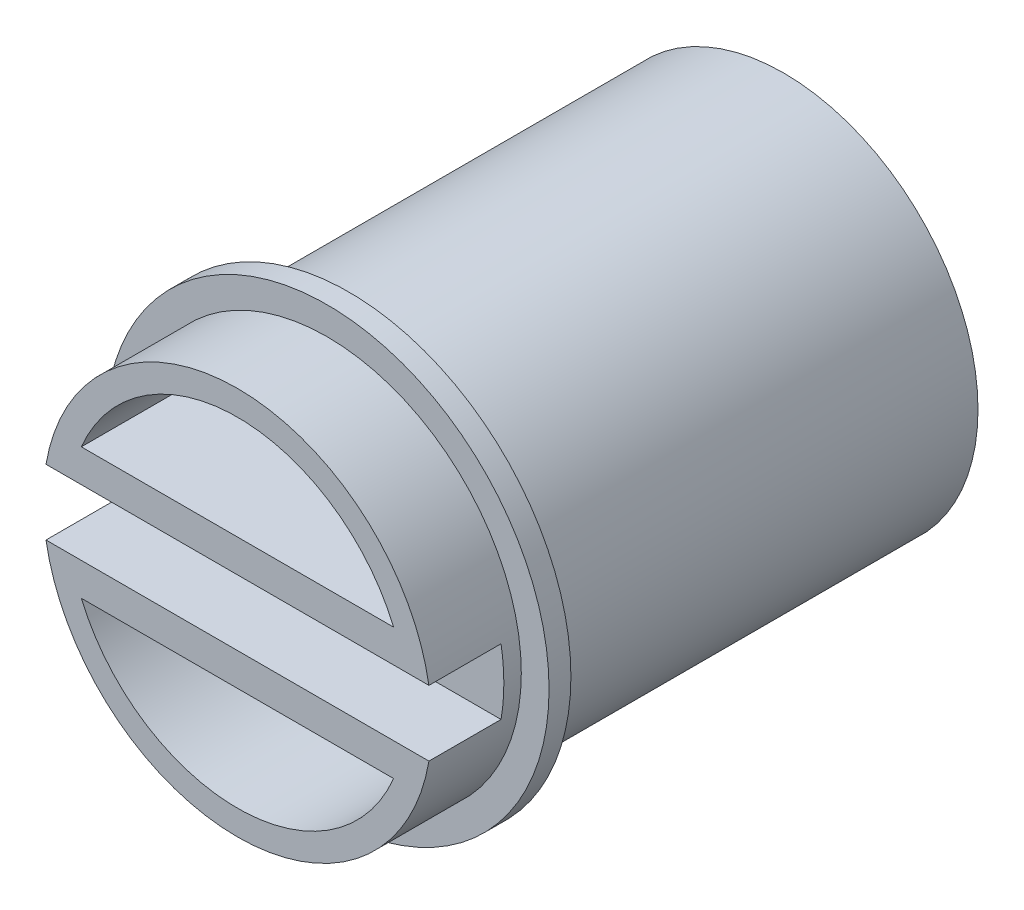
ISO-10303-21;
HEADER;
FILE_DESCRIPTION(('STEP AP214'),'2;1');
FILE_NAME('part.step','',(''),(''),'','','');
FILE_SCHEMA(('AUTOMOTIVE_DESIGN { 1 0 10303 214 1 1 1 1 }'));
ENDSEC;
DATA;
#1=APPLICATION_CONTEXT('core data for automotive mechanical design processes');
#2=APPLICATION_PROTOCOL_DEFINITION('international standard','automotive_design',2000,#1);
#3=PRODUCT_CONTEXT('',#1,'mechanical');
#4=PRODUCT('Part','Part','',(#3));
#5=PRODUCT_RELATED_PRODUCT_CATEGORY('part','',(#4));
#6=PRODUCT_DEFINITION_FORMATION('','',#4);
#7=PRODUCT_DEFINITION_CONTEXT('part definition',#1,'design');
#8=PRODUCT_DEFINITION('design','',#6,#7);
#9=PRODUCT_DEFINITION_SHAPE('','',#8);
#10=(LENGTH_UNIT() NAMED_UNIT(*) SI_UNIT(.MILLI.,.METRE.));
#11=(NAMED_UNIT(*) PLANE_ANGLE_UNIT() SI_UNIT($,.RADIAN.));
#12=(NAMED_UNIT(*) SI_UNIT($,.STERADIAN.) SOLID_ANGLE_UNIT());
#13=UNCERTAINTY_MEASURE_WITH_UNIT(LENGTH_MEASURE(1.E-05),#10,'distance_accuracy_value','');
#14=(GEOMETRIC_REPRESENTATION_CONTEXT(3) GLOBAL_UNCERTAINTY_ASSIGNED_CONTEXT((#13)) GLOBAL_UNIT_ASSIGNED_CONTEXT((#10,
#11,#12)) REPRESENTATION_CONTEXT('',''));
#15=CARTESIAN_POINT('',(0.,0.,0.));
#16=DIRECTION('',(0.,0.,1.));
#17=DIRECTION('',(1.,0.,0.));
#18=AXIS2_PLACEMENT_3D('',#15,#16,#17);
#19=CARTESIAN_POINT('',(0.,0.,-33.));
#20=DIRECTION('',(0.,0.,1.));
#21=DIRECTION('',(1.,0.,0.));
#22=AXIS2_PLACEMENT_3D('',#19,#20,#21);
#23=PLANE('',#22);
#24=DIRECTION('',(0.,-1.,0.));
#25=VECTOR('',#24,1.);
#26=CARTESIAN_POINT('',(-25.,0.,-33.));
#27=LINE('',#26,#25);
#28=CARTESIAN_POINT('',(-25.,15.,-33.));
#29=VERTEX_POINT('',#28);
#30=CARTESIAN_POINT('',(-25.,-15.,-33.));
#31=VERTEX_POINT('',#30);
#32=EDGE_CURVE('E181',#29,#31,#27,.T.);
#33=ORIENTED_EDGE('',*,*,#32,.F.);
#34=DIRECTION('',(1.,0.,0.));
#35=VECTOR('',#34,1.);
#36=CARTESIAN_POINT('',(0.,15.,-33.));
#37=LINE('',#36,#35);
#38=CARTESIAN_POINT('',(-87.6253958621586,15.,-33.));
#39=VERTEX_POINT('',#38);
#40=EDGE_CURVE('E210',#39,#29,#37,.T.);
#41=ORIENTED_EDGE('',*,*,#40,.F.);
#42=CARTESIAN_POINT('',(0.,0.,-33.));
#43=DIRECTION('',(0.,0.,1.));
#44=DIRECTION('',(1.,0.,0.));
#45=AXIS2_PLACEMENT_3D('',#42,#43,#44);
#46=CIRCLE('',#45,88.9);
#47=CARTESIAN_POINT('',(-87.6253958621586,-15.,-33.));
#48=VERTEX_POINT('',#47);
#49=EDGE_CURVE('E214',#39,#48,#46,.T.);
#50=ORIENTED_EDGE('',*,*,#49,.T.);
#51=DIRECTION('',(-1.,0.,0.));
#52=VECTOR('',#51,1.);
#53=CARTESIAN_POINT('',(0.,-15.,-33.));
#54=LINE('',#53,#52);
#55=EDGE_CURVE('E219',#31,#48,#54,.T.);
#56=ORIENTED_EDGE('',*,*,#55,.F.);
#57=EDGE_LOOP('',(#33,#41,#50,#56));
#58=FACE_BOUND('',#57,.T.);
#59=ADVANCED_FACE('F39',(#58),#23,.T.);
#60=CARTESIAN_POINT('',(0.,0.,-250.));
#61=DIRECTION('',(0.,0.,1.));
#62=DIRECTION('',(1.,0.,0.));
#63=AXIS2_PLACEMENT_3D('',#60,#61,#62);
#64=CYLINDRICAL_SURFACE('',#63,101.6);
#65=CARTESIAN_POINT('',(0.,0.,-41.));
#66=DIRECTION('',(0.,0.,1.));
#67=DIRECTION('',(1.,0.,0.));
#68=AXIS2_PLACEMENT_3D('',#65,#66,#67);
#69=CIRCLE('',#68,101.6);
#70=CARTESIAN_POINT('',(101.6,0.,-41.));
#71=VERTEX_POINT('',#70);
#72=EDGE_CURVE('E201',#71,#71,#69,.T.);
#73=ORIENTED_EDGE('',*,*,#72,.F.);
#74=EDGE_LOOP('',(#73));
#75=FACE_BOUND('',#74,.T.);
#76=CARTESIAN_POINT('',(0.,0.,-51.));
#77=DIRECTION('',(0.,0.,-1.));
#78=DIRECTION('',(-1.,0.,0.));
#79=AXIS2_PLACEMENT_3D('',#76,#77,#78);
#80=CIRCLE('',#79,101.6);
#81=CARTESIAN_POINT('',(-101.6,0.,-51.));
#82=VERTEX_POINT('',#81);
#83=EDGE_CURVE('E189',#82,#82,#80,.T.);
#84=ORIENTED_EDGE('',*,*,#83,.F.);
#85=EDGE_LOOP('',(#84));
#86=FACE_BOUND('',#85,.T.);
#87=ADVANCED_FACE('F41',(#75,#86),#64,.T.);
#88=CARTESIAN_POINT('',(0.,0.,-41.));
#89=DIRECTION('',(0.,0.,1.));
#90=DIRECTION('',(1.,0.,0.));
#91=AXIS2_PLACEMENT_3D('',#88,#89,#90);
#92=PLANE('',#91);
#93=CARTESIAN_POINT('',(0.,0.,-41.));
#94=DIRECTION('',(0.,0.,1.));
#95=DIRECTION('',(1.,0.,0.));
#96=AXIS2_PLACEMENT_3D('',#93,#94,#95);
#97=CIRCLE('',#96,88.9);
#98=CARTESIAN_POINT('',(88.9,0.,-41.));
#99=VERTEX_POINT('',#98);
#100=EDGE_CURVE('E197',#99,#99,#97,.T.);
#101=ORIENTED_EDGE('',*,*,#100,.F.);
#102=EDGE_LOOP('',(#101));
#103=FACE_BOUND('',#102,.T.);
#104=ORIENTED_EDGE('',*,*,#72,.T.);
#105=EDGE_LOOP('',(#104));
#106=FACE_BOUND('',#105,.T.);
#107=ADVANCED_FACE('F296',(#103,#106),#92,.T.);
#108=CARTESIAN_POINT('',(0.,0.,-41.));
#109=DIRECTION('',(0.,0.,1.));
#110=DIRECTION('',(1.,0.,0.));
#111=AXIS2_PLACEMENT_3D('',#108,#109,#110);
#112=CYLINDRICAL_SURFACE('',#111,88.9);
#113=CARTESIAN_POINT('',(0.,0.,0.));
#114=DIRECTION('',(0.,0.,1.));
#115=DIRECTION('',(1.,0.,0.));
#116=AXIS2_PLACEMENT_3D('',#113,#114,#115);
#117=CIRCLE('',#116,88.9);
#118=CARTESIAN_POINT('',(87.6253958621586,15.,0.));
#119=VERTEX_POINT('',#118);
#120=CARTESIAN_POINT('',(-87.6253958621586,15.,0.));
#121=VERTEX_POINT('',#120);
#122=EDGE_CURVE('E202',#119,#121,#117,.T.);
#123=ORIENTED_EDGE('',*,*,#122,.F.);
#124=DIRECTION('',(0.,0.,1.));
#125=VECTOR('',#124,1.);
#126=CARTESIAN_POINT('',(87.6253958621586,15.,-33.));
#127=LINE('',#126,#125);
#128=CARTESIAN_POINT('',(87.6253958621586,15.,-33.));
#129=VERTEX_POINT('',#128);
#130=EDGE_CURVE('E230',#129,#119,#127,.T.);
#131=ORIENTED_EDGE('',*,*,#130,.F.);
#132=CARTESIAN_POINT('',(87.6253958621586,-15.,-33.));
#133=VERTEX_POINT('',#132);
#134=EDGE_CURVE('E220',#133,#129,#46,.T.);
#135=ORIENTED_EDGE('',*,*,#134,.F.);
#136=DIRECTION('',(0.,0.,1.));
#137=VECTOR('',#136,1.);
#138=CARTESIAN_POINT('',(87.6253958621586,-15.,-33.));
#139=LINE('',#138,#137);
#140=CARTESIAN_POINT('',(87.6253958621586,-15.,0.));
#141=VERTEX_POINT('',#140);
#142=EDGE_CURVE('E235',#133,#141,#139,.T.);
#143=ORIENTED_EDGE('',*,*,#142,.T.);
#144=CARTESIAN_POINT('',(-87.6253958621586,-15.,0.));
#145=VERTEX_POINT('',#144);
#146=EDGE_CURVE('E196',#145,#141,#117,.T.);
#147=ORIENTED_EDGE('',*,*,#146,.F.);
#148=DIRECTION('',(0.,0.,1.));
#149=VECTOR('',#148,1.);
#150=CARTESIAN_POINT('',(-87.6253958621586,-15.,-33.));
#151=LINE('',#150,#149);
#152=EDGE_CURVE('E238',#48,#145,#151,.T.);
#153=ORIENTED_EDGE('',*,*,#152,.F.);
#154=ORIENTED_EDGE('',*,*,#49,.F.);
#155=DIRECTION('',(0.,0.,1.));
#156=VECTOR('',#155,1.);
#157=CARTESIAN_POINT('',(-87.6253958621586,15.,-33.));
#158=LINE('',#157,#156);
#159=EDGE_CURVE('E242',#39,#121,#158,.T.);
#160=ORIENTED_EDGE('',*,*,#159,.T.);
#161=EDGE_LOOP('',(#123,#131,#135,#143,#147,#153,#154,#160));
#162=FACE_BOUND('',#161,.T.);
#163=ORIENTED_EDGE('',*,*,#100,.T.);
#164=EDGE_LOOP('',(#163));
#165=FACE_BOUND('',#164,.T.);
#166=ADVANCED_FACE('F303',(#162,#165),#112,.T.);
#167=DIRECTION('',(0.,1.,0.));
#168=VECTOR('',#167,1.);
#169=CARTESIAN_POINT('',(25.,0.,-33.));
#170=LINE('',#169,#168);
#171=CARTESIAN_POINT('',(25.,-15.,-33.));
#172=VERTEX_POINT('',#171);
#173=CARTESIAN_POINT('',(25.,15.,-33.));
#174=VERTEX_POINT('',#173);
#175=EDGE_CURVE('E139',#172,#174,#170,.T.);
#176=ORIENTED_EDGE('',*,*,#175,.F.);
#177=EDGE_CURVE('E221',#133,#172,#54,.T.);
#178=ORIENTED_EDGE('',*,*,#177,.F.);
#179=ORIENTED_EDGE('',*,*,#134,.T.);
#180=EDGE_CURVE('E215',#174,#129,#37,.T.);
#181=ORIENTED_EDGE('',*,*,#180,.F.);
#182=EDGE_LOOP('',(#176,#178,#179,#181));
#183=FACE_BOUND('',#182,.T.);
#184=ADVANCED_FACE('F292',(#183),#23,.T.);
#185=CARTESIAN_POINT('',(0.,-15.,-33.));
#186=DIRECTION('',(0.,1.,0.));
#187=DIRECTION('',(0.,0.,1.));
#188=AXIS2_PLACEMENT_3D('',#185,#186,#187);
#189=PLANE('',#188);
#190=ORIENTED_EDGE('',*,*,#177,.T.);
#191=DIRECTION('',(0.,0.,1.));
#192=VECTOR('',#191,1.);
#193=CARTESIAN_POINT('',(25.,-15.,-287.));
#194=LINE('',#193,#192);
#195=CARTESIAN_POINT('',(25.,-15.,-250.));
#196=VERTEX_POINT('',#195);
#197=EDGE_CURVE('E174',#196,#172,#194,.T.);
#198=ORIENTED_EDGE('',*,*,#197,.F.);
#199=DIRECTION('',(1.,0.,0.));
#200=VECTOR('',#199,1.);
#201=CARTESIAN_POINT('',(0.,-15.,-250.));
#202=LINE('',#201,#200);
#203=CARTESIAN_POINT('',(-25.,-15.,-250.));
#204=VERTEX_POINT('',#203);
#205=EDGE_CURVE('E234',#204,#196,#202,.T.);
#206=ORIENTED_EDGE('',*,*,#205,.F.);
#207=DIRECTION('',(0.,0.,1.));
#208=VECTOR('',#207,1.);
#209=CARTESIAN_POINT('',(-25.,-15.,-287.));
#210=LINE('',#209,#208);
#211=EDGE_CURVE('E55',#204,#31,#210,.T.);
#212=ORIENTED_EDGE('',*,*,#211,.T.);
#213=ORIENTED_EDGE('',*,*,#55,.T.);
#214=ORIENTED_EDGE('',*,*,#152,.T.);
#215=DIRECTION('',(-1.,0.,0.));
#216=VECTOR('',#215,1.);
#217=CARTESIAN_POINT('',(0.,-15.,0.));
#218=LINE('',#217,#216);
#219=EDGE_CURVE('E227',#141,#145,#218,.T.);
#220=ORIENTED_EDGE('',*,*,#219,.F.);
#221=ORIENTED_EDGE('',*,*,#142,.F.);
#222=EDGE_LOOP('',(#190,#198,#206,#212,#213,#214,#220,#221));
#223=FACE_BOUND('',#222,.T.);
#224=ADVANCED_FACE('F302',(#223),#189,.T.);
#225=CARTESIAN_POINT('',(0.,15.,-33.));
#226=DIRECTION('',(0.,-1.,0.));
#227=DIRECTION('',(0.,0.,-1.));
#228=AXIS2_PLACEMENT_3D('',#225,#226,#227);
#229=PLANE('',#228);
#230=ORIENTED_EDGE('',*,*,#130,.T.);
#231=DIRECTION('',(1.,0.,0.));
#232=VECTOR('',#231,1.);
#233=CARTESIAN_POINT('',(0.,15.,0.));
#234=LINE('',#233,#232);
#235=EDGE_CURVE('E209',#121,#119,#234,.T.);
#236=ORIENTED_EDGE('',*,*,#235,.F.);
#237=ORIENTED_EDGE('',*,*,#159,.F.);
#238=ORIENTED_EDGE('',*,*,#40,.T.);
#239=DIRECTION('',(0.,0.,1.));
#240=VECTOR('',#239,1.);
#241=CARTESIAN_POINT('',(-25.,15.,-287.));
#242=LINE('',#241,#240);
#243=CARTESIAN_POINT('',(-25.,15.,-250.));
#244=VERTEX_POINT('',#243);
#245=EDGE_CURVE('E162',#244,#29,#242,.T.);
#246=ORIENTED_EDGE('',*,*,#245,.F.);
#247=DIRECTION('',(-1.,0.,0.));
#248=VECTOR('',#247,1.);
#249=CARTESIAN_POINT('',(0.,15.,-250.));
#250=LINE('',#249,#248);
#251=CARTESIAN_POINT('',(25.,15.,-250.));
#252=VERTEX_POINT('',#251);
#253=EDGE_CURVE('E252',#252,#244,#250,.T.);
#254=ORIENTED_EDGE('',*,*,#253,.F.);
#255=DIRECTION('',(0.,0.,1.));
#256=VECTOR('',#255,1.);
#257=CARTESIAN_POINT('',(25.,15.,-287.));
#258=LINE('',#257,#256);
#259=EDGE_CURVE('E170',#252,#174,#258,.T.);
#260=ORIENTED_EDGE('',*,*,#259,.T.);
#261=ORIENTED_EDGE('',*,*,#180,.T.);
#262=EDGE_LOOP('',(#230,#236,#237,#238,#246,#254,#260,#261));
#263=FACE_BOUND('',#262,.T.);
#264=ADVANCED_FACE('F309',(#263),#229,.T.);
#265=CARTESIAN_POINT('',(0.,0.,0.));
#266=DIRECTION('',(0.,0.,1.));
#267=DIRECTION('',(1.,0.,0.));
#268=AXIS2_PLACEMENT_3D('',#265,#266,#267);
#269=PLANE('',#268);
#270=CARTESIAN_POINT('',(0.,0.,0.));
#271=DIRECTION('',(0.,0.,1.));
#272=DIRECTION('',(1.,0.,0.));
#273=AXIS2_PLACEMENT_3D('',#270,#271,#272);
#274=CIRCLE('',#273,77.5);
#275=CARTESIAN_POINT('',(-71.4580296397823,-30.,0.));
#276=VERTEX_POINT('',#275);
#277=CARTESIAN_POINT('',(71.4580296397823,-30.,0.));
#278=VERTEX_POINT('',#277);
#279=EDGE_CURVE('E63',#276,#278,#274,.T.);
#280=ORIENTED_EDGE('',*,*,#279,.F.);
#281=DIRECTION('',(-1.,0.,0.));
#282=VECTOR('',#281,1.);
#283=CARTESIAN_POINT('',(-71.4580296397823,-30.,0.));
#284=LINE('',#283,#282);
#285=EDGE_CURVE('E161',#278,#276,#284,.T.);
#286=ORIENTED_EDGE('',*,*,#285,.F.);
#287=EDGE_LOOP('',(#280,#286));
#288=FACE_BOUND('',#287,.T.);
#289=ORIENTED_EDGE('',*,*,#219,.T.);
#290=ORIENTED_EDGE('',*,*,#146,.T.);
#291=EDGE_LOOP('',(#289,#290));
#292=FACE_BOUND('',#291,.T.);
#293=ADVANCED_FACE('F328',(#288,#292),#269,.T.);
#294=CARTESIAN_POINT('',(0.,0.,0.));
#295=DIRECTION('',(0.,0.,1.));
#296=DIRECTION('',(1.,0.,0.));
#297=AXIS2_PLACEMENT_3D('',#294,#295,#296);
#298=CIRCLE('',#297,77.5);
#299=CARTESIAN_POINT('',(71.4580296397823,30.,0.));
#300=VERTEX_POINT('',#299);
#301=CARTESIAN_POINT('',(-71.4580296397823,30.,0.));
#302=VERTEX_POINT('',#301);
#303=EDGE_CURVE('E134',#300,#302,#298,.T.);
#304=ORIENTED_EDGE('',*,*,#303,.F.);
#305=DIRECTION('',(1.,0.,0.));
#306=VECTOR('',#305,1.);
#307=CARTESIAN_POINT('',(-71.4580296397823,30.,0.));
#308=LINE('',#307,#306);
#309=EDGE_CURVE('E143',#302,#300,#308,.T.);
#310=ORIENTED_EDGE('',*,*,#309,.F.);
#311=EDGE_LOOP('',(#304,#310));
#312=FACE_BOUND('',#311,.T.);
#313=ORIENTED_EDGE('',*,*,#235,.T.);
#314=ORIENTED_EDGE('',*,*,#122,.T.);
#315=EDGE_LOOP('',(#313,#314));
#316=FACE_BOUND('',#315,.T.);
#317=ADVANCED_FACE('F148',(#312,#316),#269,.T.);
#318=CARTESIAN_POINT('',(0.,0.,-51.));
#319=DIRECTION('',(0.,0.,-1.));
#320=DIRECTION('',(-1.,0.,0.));
#321=AXIS2_PLACEMENT_3D('',#318,#319,#320);
#322=PLANE('',#321);
#323=CARTESIAN_POINT('',(0.,0.,-51.));
#324=DIRECTION('',(0.,0.,-1.));
#325=DIRECTION('',(-1.,0.,0.));
#326=AXIS2_PLACEMENT_3D('',#323,#324,#325);
#327=CIRCLE('',#326,88.9);
#328=CARTESIAN_POINT('',(-88.9,0.,-51.));
#329=VERTEX_POINT('',#328);
#330=EDGE_CURVE('E185',#329,#329,#327,.T.);
#331=ORIENTED_EDGE('',*,*,#330,.F.);
#332=EDGE_LOOP('',(#331));
#333=FACE_BOUND('',#332,.T.);
#334=ORIENTED_EDGE('',*,*,#83,.T.);
#335=EDGE_LOOP('',(#334));
#336=FACE_BOUND('',#335,.T.);
#337=ADVANCED_FACE('F280',(#333,#336),#322,.T.);
#338=CARTESIAN_POINT('',(0.,0.,-51.));
#339=DIRECTION('',(0.,0.,-1.));
#340=DIRECTION('',(-1.,0.,0.));
#341=AXIS2_PLACEMENT_3D('',#338,#339,#340);
#342=CYLINDRICAL_SURFACE('',#341,88.9);
#343=ORIENTED_EDGE('',*,*,#330,.T.);
#344=EDGE_LOOP('',(#343));
#345=FACE_BOUND('',#344,.T.);
#346=CARTESIAN_POINT('',(0.,0.,-250.));
#347=DIRECTION('',(0.,0.,-1.));
#348=DIRECTION('',(-1.,0.,0.));
#349=AXIS2_PLACEMENT_3D('',#346,#347,#348);
#350=CIRCLE('',#349,88.9);
#351=CARTESIAN_POINT('',(-88.9,0.,-250.));
#352=VERTEX_POINT('',#351);
#353=EDGE_CURVE('E184',#352,#352,#350,.T.);
#354=ORIENTED_EDGE('',*,*,#353,.F.);
#355=EDGE_LOOP('',(#354));
#356=FACE_BOUND('',#355,.T.);
#357=ADVANCED_FACE('F273',(#345,#356),#342,.T.);
#358=CARTESIAN_POINT('',(0.,0.,-250.));
#359=DIRECTION('',(0.,0.,1.));
#360=DIRECTION('',(1.,0.,0.));
#361=AXIS2_PLACEMENT_3D('',#358,#359,#360);
#362=PLANE('',#361);
#363=DIRECTION('',(1.,0.,0.));
#364=VECTOR('',#363,1.);
#365=CARTESIAN_POINT('',(0.,30.,-250.));
#366=LINE('',#365,#364);
#367=CARTESIAN_POINT('',(-71.4580296397823,30.,-250.));
#368=VERTEX_POINT('',#367);
#369=CARTESIAN_POINT('',(71.4580296397823,30.,-250.));
#370=VERTEX_POINT('',#369);
#371=EDGE_CURVE('E48',#368,#370,#366,.T.);
#372=ORIENTED_EDGE('',*,*,#371,.T.);
#373=CARTESIAN_POINT('',(0.,0.,-250.));
#374=DIRECTION('',(0.,0.,1.));
#375=DIRECTION('',(1.,0.,0.));
#376=AXIS2_PLACEMENT_3D('',#373,#374,#375);
#377=CIRCLE('',#376,77.5);
#378=EDGE_CURVE('E11',#370,#368,#377,.T.);
#379=ORIENTED_EDGE('',*,*,#378,.T.);
#380=EDGE_LOOP('',(#372,#379));
#381=FACE_BOUND('',#380,.T.);
#382=DIRECTION('',(-1.,0.,0.));
#383=VECTOR('',#382,1.);
#384=CARTESIAN_POINT('',(0.,-30.,-250.));
#385=LINE('',#384,#383);
#386=CARTESIAN_POINT('',(71.4580296397823,-30.,-250.));
#387=VERTEX_POINT('',#386);
#388=CARTESIAN_POINT('',(-71.4580296397823,-30.,-250.));
#389=VERTEX_POINT('',#388);
#390=EDGE_CURVE('E260',#387,#389,#385,.T.);
#391=ORIENTED_EDGE('',*,*,#390,.T.);
#392=CARTESIAN_POINT('',(0.,0.,-250.));
#393=DIRECTION('',(0.,0.,1.));
#394=DIRECTION('',(1.,0.,0.));
#395=AXIS2_PLACEMENT_3D('',#392,#393,#394);
#396=CIRCLE('',#395,77.5);
#397=EDGE_CURVE('E264',#389,#387,#396,.T.);
#398=ORIENTED_EDGE('',*,*,#397,.T.);
#399=EDGE_LOOP('',(#391,#398));
#400=FACE_BOUND('',#399,.T.);
#401=ORIENTED_EDGE('',*,*,#253,.T.);
#402=DIRECTION('',(0.,-1.,0.));
#403=VECTOR('',#402,1.);
#404=CARTESIAN_POINT('',(-25.,0.,-250.));
#405=LINE('',#404,#403);
#406=EDGE_CURVE('E256',#244,#204,#405,.T.);
#407=ORIENTED_EDGE('',*,*,#406,.T.);
#408=ORIENTED_EDGE('',*,*,#205,.T.);
#409=DIRECTION('',(0.,1.,0.));
#410=VECTOR('',#409,1.);
#411=CARTESIAN_POINT('',(25.,0.,-250.));
#412=LINE('',#411,#410);
#413=EDGE_CURVE('E248',#196,#252,#412,.T.);
#414=ORIENTED_EDGE('',*,*,#413,.T.);
#415=EDGE_LOOP('',(#401,#407,#408,#414));
#416=FACE_BOUND('',#415,.T.);
#417=ORIENTED_EDGE('',*,*,#353,.T.);
#418=EDGE_LOOP('',(#417));
#419=FACE_BOUND('',#418,.T.);
#420=ADVANCED_FACE('F269',(#381,#400,#416,#419),#362,.F.);
#421=CARTESIAN_POINT('',(-25.,-15.,-287.));
#422=DIRECTION('',(-1.,0.,0.));
#423=DIRECTION('',(0.,0.,1.));
#424=AXIS2_PLACEMENT_3D('',#421,#422,#423);
#425=PLANE('',#424);
#426=ORIENTED_EDGE('',*,*,#32,.T.);
#427=ORIENTED_EDGE('',*,*,#211,.F.);
#428=ORIENTED_EDGE('',*,*,#406,.F.);
#429=ORIENTED_EDGE('',*,*,#245,.T.);
#430=EDGE_LOOP('',(#426,#427,#428,#429));
#431=FACE_BOUND('',#430,.T.);
#432=ADVANCED_FACE('F272',(#431),#425,.F.);
#433=CARTESIAN_POINT('',(25.,15.,-287.));
#434=DIRECTION('',(1.,0.,0.));
#435=DIRECTION('',(0.,1.,0.));
#436=AXIS2_PLACEMENT_3D('',#433,#434,#435);
#437=PLANE('',#436);
#438=ORIENTED_EDGE('',*,*,#175,.T.);
#439=ORIENTED_EDGE('',*,*,#259,.F.);
#440=ORIENTED_EDGE('',*,*,#413,.F.);
#441=ORIENTED_EDGE('',*,*,#197,.T.);
#442=EDGE_LOOP('',(#438,#439,#440,#441));
#443=FACE_BOUND('',#442,.T.);
#444=ADVANCED_FACE('F377',(#443),#437,.F.);
#445=CARTESIAN_POINT('',(0.,0.,-287.));
#446=DIRECTION('',(0.,0.,1.));
#447=DIRECTION('',(1.,0.,0.));
#448=AXIS2_PLACEMENT_3D('',#445,#446,#447);
#449=CYLINDRICAL_SURFACE('',#448,77.5);
#450=DIRECTION('',(0.,0.,1.));
#451=VECTOR('',#450,1.);
#452=CARTESIAN_POINT('',(-71.4580296397823,-30.,-287.));
#453=LINE('',#452,#451);
#454=EDGE_CURVE('E151',#389,#276,#453,.T.);
#455=ORIENTED_EDGE('',*,*,#454,.T.);
#456=ORIENTED_EDGE('',*,*,#279,.T.);
#457=DIRECTION('',(0.,0.,1.));
#458=VECTOR('',#457,1.);
#459=CARTESIAN_POINT('',(71.4580296397823,-30.,-287.));
#460=LINE('',#459,#458);
#461=EDGE_CURVE('E154',#387,#278,#460,.T.);
#462=ORIENTED_EDGE('',*,*,#461,.F.);
#463=ORIENTED_EDGE('',*,*,#397,.F.);
#464=EDGE_LOOP('',(#455,#456,#462,#463));
#465=FACE_BOUND('',#464,.T.);
#466=ADVANCED_FACE('F386',(#465),#449,.F.);
#467=CARTESIAN_POINT('',(-71.4580296397823,-30.,-287.));
#468=DIRECTION('',(0.,1.,0.));
#469=DIRECTION('',(0.,0.,1.));
#470=AXIS2_PLACEMENT_3D('',#467,#468,#469);
#471=PLANE('',#470);
#472=ORIENTED_EDGE('',*,*,#461,.T.);
#473=ORIENTED_EDGE('',*,*,#285,.T.);
#474=ORIENTED_EDGE('',*,*,#454,.F.);
#475=ORIENTED_EDGE('',*,*,#390,.F.);
#476=EDGE_LOOP('',(#472,#473,#474,#475));
#477=FACE_BOUND('',#476,.T.);
#478=ADVANCED_FACE('F395',(#477),#471,.F.);
#479=CARTESIAN_POINT('',(0.,0.,-287.));
#480=DIRECTION('',(0.,0.,1.));
#481=DIRECTION('',(1.,0.,0.));
#482=AXIS2_PLACEMENT_3D('',#479,#480,#481);
#483=CYLINDRICAL_SURFACE('',#482,77.5);
#484=DIRECTION('',(0.,0.,1.));
#485=VECTOR('',#484,1.);
#486=CARTESIAN_POINT('',(71.4580296397823,30.,-287.));
#487=LINE('',#486,#485);
#488=EDGE_CURVE('E129',#370,#300,#487,.T.);
#489=ORIENTED_EDGE('',*,*,#488,.T.);
#490=ORIENTED_EDGE('',*,*,#303,.T.);
#491=DIRECTION('',(0.,0.,1.));
#492=VECTOR('',#491,1.);
#493=CARTESIAN_POINT('',(-71.4580296397823,30.,-287.));
#494=LINE('',#493,#492);
#495=EDGE_CURVE('E140',#368,#302,#494,.T.);
#496=ORIENTED_EDGE('',*,*,#495,.F.);
#497=ORIENTED_EDGE('',*,*,#378,.F.);
#498=EDGE_LOOP('',(#489,#490,#496,#497));
#499=FACE_BOUND('',#498,.T.);
#500=ADVANCED_FACE('F131',(#499),#483,.F.);
#501=CARTESIAN_POINT('',(-71.4580296397823,30.,-287.));
#502=DIRECTION('',(0.,-1.,0.));
#503=DIRECTION('',(0.,0.,-1.));
#504=AXIS2_PLACEMENT_3D('',#501,#502,#503);
#505=PLANE('',#504);
#506=ORIENTED_EDGE('',*,*,#495,.T.);
#507=ORIENTED_EDGE('',*,*,#309,.T.);
#508=ORIENTED_EDGE('',*,*,#488,.F.);
#509=ORIENTED_EDGE('',*,*,#371,.F.);
#510=EDGE_LOOP('',(#506,#507,#508,#509));
#511=FACE_BOUND('',#510,.T.);
#512=ADVANCED_FACE('F144',(#511),#505,.F.);
#513=CLOSED_SHELL('',(#59,#87,#107,#166,#184,#224,#264,#293,#317,#337,#357,#420,#432,#444,#466,
#478,#500,#512));
#514=MANIFOLD_SOLID_BREP('B2',#513);
#515=ADVANCED_BREP_SHAPE_REPRESENTATION('',(#18,#514),#14);
#516=SHAPE_DEFINITION_REPRESENTATION(#9,#515);
ENDSEC;
END-ISO-10303-21;
